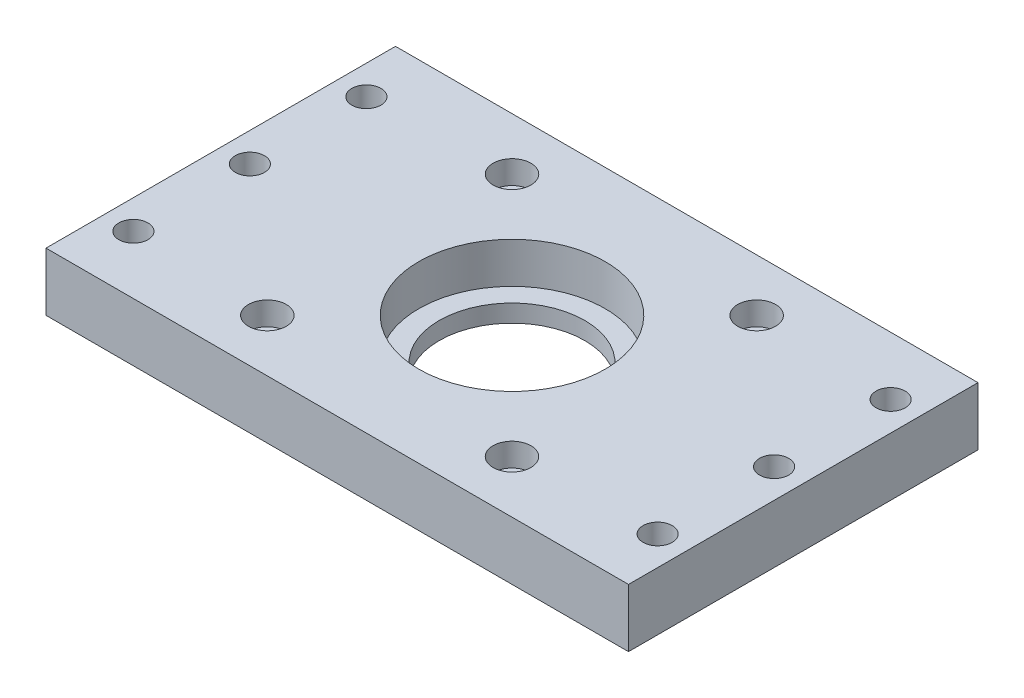
ISO-10303-21;
HEADER;
FILE_DESCRIPTION(('STEP AP214'),'2;1');
FILE_NAME('part.step','',(''),(''),'','','');
FILE_SCHEMA(('AUTOMOTIVE_DESIGN { 1 0 10303 214 1 1 1 1 }'));
ENDSEC;
DATA;
#1=APPLICATION_CONTEXT('core data for automotive mechanical design processes');
#2=APPLICATION_PROTOCOL_DEFINITION('international standard','automotive_design',2000,#1);
#3=PRODUCT_CONTEXT('',#1,'mechanical');
#4=PRODUCT('Part','Part','',(#3));
#5=PRODUCT_RELATED_PRODUCT_CATEGORY('part','',(#4));
#6=PRODUCT_DEFINITION_FORMATION('','',#4);
#7=PRODUCT_DEFINITION_CONTEXT('part definition',#1,'design');
#8=PRODUCT_DEFINITION('design','',#6,#7);
#9=PRODUCT_DEFINITION_SHAPE('','',#8);
#10=(LENGTH_UNIT() NAMED_UNIT(*) SI_UNIT(.MILLI.,.METRE.));
#11=(NAMED_UNIT(*) PLANE_ANGLE_UNIT() SI_UNIT($,.RADIAN.));
#12=(NAMED_UNIT(*) SI_UNIT($,.STERADIAN.) SOLID_ANGLE_UNIT());
#13=UNCERTAINTY_MEASURE_WITH_UNIT(LENGTH_MEASURE(1.E-05),#10,'distance_accuracy_value','');
#14=(GEOMETRIC_REPRESENTATION_CONTEXT(3) GLOBAL_UNCERTAINTY_ASSIGNED_CONTEXT((#13)) GLOBAL_UNIT_ASSIGNED_CONTEXT((#10,
#11,#12)) REPRESENTATION_CONTEXT('',''));
#15=CARTESIAN_POINT('',(0.,0.,0.));
#16=DIRECTION('',(0.,0.,1.));
#17=DIRECTION('',(1.,0.,0.));
#18=AXIS2_PLACEMENT_3D('',#15,#16,#17);
#19=CARTESIAN_POINT('',(20.9999999999998,0.,-21.0000000000002));
#20=DIRECTION('',(0.,1.,0.));
#21=DIRECTION('',(0.,0.,1.));
#22=AXIS2_PLACEMENT_3D('',#19,#20,#21);
#23=CYLINDRICAL_SURFACE('',#22,1.5);
#24=CARTESIAN_POINT('',(20.9999999999998,0.,-21.0000000000002));
#25=DIRECTION('',(0.,1.,0.));
#26=DIRECTION('',(-1.,0.,0.));
#27=AXIS2_PLACEMENT_3D('',#24,#25,#26);
#28=CIRCLE('',#27,1.5);
#29=CARTESIAN_POINT('',(19.4999999999998,0.,-21.0000000000002));
#30=VERTEX_POINT('',#29);
#31=EDGE_CURVE('E130',#30,#30,#28,.T.);
#32=ORIENTED_EDGE('',*,*,#31,.F.);
#33=EDGE_LOOP('',(#32));
#34=FACE_BOUND('',#33,.T.);
#35=CARTESIAN_POINT('',(20.9999999999998,6.,-21.0000000000002));
#36=DIRECTION('',(0.,1.,0.));
#37=DIRECTION('',(0.,0.,1.));
#38=AXIS2_PLACEMENT_3D('',#35,#36,#37);
#39=CIRCLE('',#38,1.5);
#40=CARTESIAN_POINT('',(20.9999999999998,6.,-19.5000000000002));
#41=VERTEX_POINT('',#40);
#42=EDGE_CURVE('E45',#41,#41,#39,.F.);
#43=ORIENTED_EDGE('',*,*,#42,.F.);
#44=EDGE_LOOP('',(#43));
#45=FACE_BOUND('',#44,.T.);
#46=ADVANCED_FACE('F41',(#34,#45),#23,.F.);
#47=CARTESIAN_POINT('',(21.,0.,21.));
#48=DIRECTION('',(0.,1.,0.));
#49=DIRECTION('',(0.,0.,1.));
#50=AXIS2_PLACEMENT_3D('',#47,#48,#49);
#51=CYLINDRICAL_SURFACE('',#50,1.5);
#52=CARTESIAN_POINT('',(21.,0.,21.));
#53=DIRECTION('',(0.,1.,0.));
#54=DIRECTION('',(0.,0.,-1.));
#55=AXIS2_PLACEMENT_3D('',#52,#53,#54);
#56=CIRCLE('',#55,1.5);
#57=CARTESIAN_POINT('',(21.,0.,19.5));
#58=VERTEX_POINT('',#57);
#59=EDGE_CURVE('E134',#58,#58,#56,.T.);
#60=ORIENTED_EDGE('',*,*,#59,.F.);
#61=EDGE_LOOP('',(#60));
#62=FACE_BOUND('',#61,.T.);
#63=CARTESIAN_POINT('',(21.,6.,21.));
#64=DIRECTION('',(0.,1.,0.));
#65=DIRECTION('',(0.,0.,1.));
#66=AXIS2_PLACEMENT_3D('',#63,#64,#65);
#67=CIRCLE('',#66,1.5);
#68=CARTESIAN_POINT('',(21.,6.,22.5));
#69=VERTEX_POINT('',#68);
#70=EDGE_CURVE('E124',#69,#69,#67,.F.);
#71=ORIENTED_EDGE('',*,*,#70,.F.);
#72=EDGE_LOOP('',(#71));
#73=FACE_BOUND('',#72,.T.);
#74=ADVANCED_FACE('F222',(#62,#73),#51,.F.);
#75=CARTESIAN_POINT('',(-20.9999999999999,0.,21.0000000000001));
#76=DIRECTION('',(0.,1.,0.));
#77=DIRECTION('',(0.,0.,1.));
#78=AXIS2_PLACEMENT_3D('',#75,#76,#77);
#79=CYLINDRICAL_SURFACE('',#78,1.5);
#80=CARTESIAN_POINT('',(-20.9999999999999,0.,21.0000000000001));
#81=DIRECTION('',(0.,1.,0.));
#82=DIRECTION('',(1.,0.,0.));
#83=AXIS2_PLACEMENT_3D('',#80,#81,#82);
#84=CIRCLE('',#83,1.5);
#85=CARTESIAN_POINT('',(-19.4999999999999,0.,21.0000000000001));
#86=VERTEX_POINT('',#85);
#87=EDGE_CURVE('E139',#86,#86,#84,.T.);
#88=ORIENTED_EDGE('',*,*,#87,.F.);
#89=EDGE_LOOP('',(#88));
#90=FACE_BOUND('',#89,.T.);
#91=CARTESIAN_POINT('',(-20.9999999999999,6.,21.0000000000001));
#92=DIRECTION('',(0.,1.,0.));
#93=DIRECTION('',(0.,0.,1.));
#94=AXIS2_PLACEMENT_3D('',#91,#92,#93);
#95=CIRCLE('',#94,1.5);
#96=CARTESIAN_POINT('',(-20.9999999999999,6.,22.5000000000001));
#97=VERTEX_POINT('',#96);
#98=EDGE_CURVE('E122',#97,#97,#95,.F.);
#99=ORIENTED_EDGE('',*,*,#98,.F.);
#100=EDGE_LOOP('',(#99));
#101=FACE_BOUND('',#100,.T.);
#102=ADVANCED_FACE('F228',(#90,#101),#79,.F.);
#103=CARTESIAN_POINT('',(-21.,0.,-21.));
#104=DIRECTION('',(0.,1.,0.));
#105=DIRECTION('',(0.,0.,1.));
#106=AXIS2_PLACEMENT_3D('',#103,#104,#105);
#107=CYLINDRICAL_SURFACE('',#106,1.5);
#108=CARTESIAN_POINT('',(-21.,0.,-21.));
#109=DIRECTION('',(0.,1.,0.));
#110=DIRECTION('',(0.,0.,1.));
#111=AXIS2_PLACEMENT_3D('',#108,#109,#110);
#112=CIRCLE('',#111,1.5);
#113=CARTESIAN_POINT('',(-21.,0.,-19.5));
#114=VERTEX_POINT('',#113);
#115=EDGE_CURVE('E120',#114,#114,#112,.T.);
#116=ORIENTED_EDGE('',*,*,#115,.F.);
#117=EDGE_LOOP('',(#116));
#118=FACE_BOUND('',#117,.T.);
#119=CARTESIAN_POINT('',(-21.,6.,-21.));
#120=DIRECTION('',(0.,1.,0.));
#121=DIRECTION('',(0.,0.,1.));
#122=AXIS2_PLACEMENT_3D('',#119,#120,#121);
#123=CIRCLE('',#122,1.5);
#124=CARTESIAN_POINT('',(-21.,6.,-19.5));
#125=VERTEX_POINT('',#124);
#126=EDGE_CURVE('E117',#125,#125,#123,.F.);
#127=ORIENTED_EDGE('',*,*,#126,.F.);
#128=EDGE_LOOP('',(#127));
#129=FACE_BOUND('',#128,.T.);
#130=ADVANCED_FACE('F244',(#118,#129),#107,.F.);
#131=CARTESIAN_POINT('',(50.,10.,-30.));
#132=DIRECTION('',(-1.,0.,0.));
#133=DIRECTION('',(0.,0.,1.));
#134=AXIS2_PLACEMENT_3D('',#131,#132,#133);
#135=PLANE('',#134);
#136=DIRECTION('',(0.,0.,-1.));
#137=VECTOR('',#136,1.);
#138=CARTESIAN_POINT('',(50.,0.,-30.));
#139=LINE('',#138,#137);
#140=CARTESIAN_POINT('',(50.,0.,30.));
#141=VERTEX_POINT('',#140);
#142=CARTESIAN_POINT('',(50.,0.,-30.));
#143=VERTEX_POINT('',#142);
#144=EDGE_CURVE('E108',#141,#143,#139,.T.);
#145=ORIENTED_EDGE('',*,*,#144,.T.);
#146=DIRECTION('',(0.,-1.,0.));
#147=VECTOR('',#146,1.);
#148=CARTESIAN_POINT('',(50.,10.,-30.));
#149=LINE('',#148,#147);
#150=CARTESIAN_POINT('',(50.,10.,-30.));
#151=VERTEX_POINT('',#150);
#152=EDGE_CURVE('E11',#151,#143,#149,.T.);
#153=ORIENTED_EDGE('',*,*,#152,.F.);
#154=DIRECTION('',(0.,0.,-1.));
#155=VECTOR('',#154,1.);
#156=CARTESIAN_POINT('',(50.,10.,-30.));
#157=LINE('',#156,#155);
#158=CARTESIAN_POINT('',(50.,10.,30.));
#159=VERTEX_POINT('',#158);
#160=EDGE_CURVE('E95',#159,#151,#157,.T.);
#161=ORIENTED_EDGE('',*,*,#160,.F.);
#162=DIRECTION('',(0.,-1.,0.));
#163=VECTOR('',#162,1.);
#164=CARTESIAN_POINT('',(50.,10.,30.));
#165=LINE('',#164,#163);
#166=EDGE_CURVE('E104',#159,#141,#165,.T.);
#167=ORIENTED_EDGE('',*,*,#166,.T.);
#168=EDGE_LOOP('',(#145,#153,#161,#167));
#169=FACE_BOUND('',#168,.T.);
#170=ADVANCED_FACE('F43',(#169),#135,.F.);
#171=CARTESIAN_POINT('',(-50.,10.,-30.));
#172=DIRECTION('',(0.,0.,1.));
#173=DIRECTION('',(1.,0.,0.));
#174=AXIS2_PLACEMENT_3D('',#171,#172,#173);
#175=PLANE('',#174);
#176=DIRECTION('',(-1.,0.,0.));
#177=VECTOR('',#176,1.);
#178=CARTESIAN_POINT('',(-50.,0.,-30.));
#179=LINE('',#178,#177);
#180=CARTESIAN_POINT('',(-50.,0.,-30.));
#181=VERTEX_POINT('',#180);
#182=EDGE_CURVE('E99',#143,#181,#179,.T.);
#183=ORIENTED_EDGE('',*,*,#182,.T.);
#184=DIRECTION('',(0.,-1.,0.));
#185=VECTOR('',#184,1.);
#186=CARTESIAN_POINT('',(-50.,10.,-30.));
#187=LINE('',#186,#185);
#188=CARTESIAN_POINT('',(-50.,10.,-30.));
#189=VERTEX_POINT('',#188);
#190=EDGE_CURVE('E51',#189,#181,#187,.T.);
#191=ORIENTED_EDGE('',*,*,#190,.F.);
#192=DIRECTION('',(-1.,0.,0.));
#193=VECTOR('',#192,1.);
#194=CARTESIAN_POINT('',(-50.,10.,-30.));
#195=LINE('',#194,#193);
#196=EDGE_CURVE('E90',#151,#189,#195,.T.);
#197=ORIENTED_EDGE('',*,*,#196,.F.);
#198=ORIENTED_EDGE('',*,*,#152,.T.);
#199=EDGE_LOOP('',(#183,#191,#197,#198));
#200=FACE_BOUND('',#199,.T.);
#201=ADVANCED_FACE('F98',(#200),#175,.F.);
#202=CARTESIAN_POINT('',(-50.,10.,-30.));
#203=DIRECTION('',(1.,0.,0.));
#204=DIRECTION('',(0.,0.,-1.));
#205=AXIS2_PLACEMENT_3D('',#202,#203,#204);
#206=PLANE('',#205);
#207=DIRECTION('',(0.,0.,1.));
#208=VECTOR('',#207,1.);
#209=CARTESIAN_POINT('',(-50.,0.,-30.));
#210=LINE('',#209,#208);
#211=CARTESIAN_POINT('',(-50.,0.,30.));
#212=VERTEX_POINT('',#211);
#213=EDGE_CURVE('E77',#181,#212,#210,.T.);
#214=ORIENTED_EDGE('',*,*,#213,.T.);
#215=DIRECTION('',(0.,-1.,0.));
#216=VECTOR('',#215,1.);
#217=CARTESIAN_POINT('',(-50.,10.,30.));
#218=LINE('',#217,#216);
#219=CARTESIAN_POINT('',(-50.,10.,30.));
#220=VERTEX_POINT('',#219);
#221=EDGE_CURVE('E100',#220,#212,#218,.T.);
#222=ORIENTED_EDGE('',*,*,#221,.F.);
#223=DIRECTION('',(0.,0.,1.));
#224=VECTOR('',#223,1.);
#225=CARTESIAN_POINT('',(-50.,10.,-30.));
#226=LINE('',#225,#224);
#227=EDGE_CURVE('E93',#189,#220,#226,.T.);
#228=ORIENTED_EDGE('',*,*,#227,.F.);
#229=ORIENTED_EDGE('',*,*,#190,.T.);
#230=EDGE_LOOP('',(#214,#222,#228,#229));
#231=FACE_BOUND('',#230,.T.);
#232=ADVANCED_FACE('F102',(#231),#206,.F.);
#233=CARTESIAN_POINT('',(-50.,10.,30.));
#234=DIRECTION('',(0.,0.,-1.));
#235=DIRECTION('',(-1.,0.,0.));
#236=AXIS2_PLACEMENT_3D('',#233,#234,#235);
#237=PLANE('',#236);
#238=DIRECTION('',(1.,0.,0.));
#239=VECTOR('',#238,1.);
#240=CARTESIAN_POINT('',(-50.,0.,30.));
#241=LINE('',#240,#239);
#242=EDGE_CURVE('E83',#212,#141,#241,.T.);
#243=ORIENTED_EDGE('',*,*,#242,.T.);
#244=ORIENTED_EDGE('',*,*,#166,.F.);
#245=DIRECTION('',(1.,0.,0.));
#246=VECTOR('',#245,1.);
#247=CARTESIAN_POINT('',(-50.,10.,30.));
#248=LINE('',#247,#246);
#249=EDGE_CURVE('E60',#220,#159,#248,.T.);
#250=ORIENTED_EDGE('',*,*,#249,.F.);
#251=ORIENTED_EDGE('',*,*,#221,.T.);
#252=EDGE_LOOP('',(#243,#244,#250,#251));
#253=FACE_BOUND('',#252,.T.);
#254=ADVANCED_FACE('F209',(#253),#237,.F.);
#255=CARTESIAN_POINT('',(0.,10.,0.));
#256=DIRECTION('',(0.,1.,0.));
#257=DIRECTION('',(0.,0.,1.));
#258=AXIS2_PLACEMENT_3D('',#255,#256,#257);
#259=PLANE('',#258);
#260=CARTESIAN_POINT('',(-20.9999999999999,10.,21.0000000000001));
#261=DIRECTION('',(0.,1.,0.));
#262=DIRECTION('',(1.,0.,0.));
#263=AXIS2_PLACEMENT_3D('',#260,#261,#262);
#264=CIRCLE('',#263,3.25);
#265=CARTESIAN_POINT('',(-17.7499999999999,10.,21.0000000000001));
#266=VERTEX_POINT('',#265);
#267=EDGE_CURVE('E545',#266,#266,#264,.T.);
#268=ORIENTED_EDGE('',*,*,#267,.F.);
#269=EDGE_LOOP('',(#268));
#270=FACE_BOUND('',#269,.T.);
#271=CARTESIAN_POINT('',(21.,10.,21.));
#272=DIRECTION('',(0.,1.,0.));
#273=DIRECTION('',(0.,0.,-1.));
#274=AXIS2_PLACEMENT_3D('',#271,#272,#273);
#275=CIRCLE('',#274,3.25);
#276=CARTESIAN_POINT('',(21.,10.,17.75));
#277=VERTEX_POINT('',#276);
#278=EDGE_CURVE('E539',#277,#277,#275,.T.);
#279=ORIENTED_EDGE('',*,*,#278,.F.);
#280=EDGE_LOOP('',(#279));
#281=FACE_BOUND('',#280,.T.);
#282=CARTESIAN_POINT('',(20.9999999999998,10.,-21.0000000000002));
#283=DIRECTION('',(0.,1.,0.));
#284=DIRECTION('',(-1.,0.,0.));
#285=AXIS2_PLACEMENT_3D('',#282,#283,#284);
#286=CIRCLE('',#285,3.25);
#287=CARTESIAN_POINT('',(17.7499999999998,10.,-21.0000000000002));
#288=VERTEX_POINT('',#287);
#289=EDGE_CURVE('E533',#288,#288,#286,.T.);
#290=ORIENTED_EDGE('',*,*,#289,.F.);
#291=EDGE_LOOP('',(#290));
#292=FACE_BOUND('',#291,.T.);
#293=CARTESIAN_POINT('',(-21.,10.,-21.));
#294=DIRECTION('',(0.,1.,0.));
#295=DIRECTION('',(0.,0.,1.));
#296=AXIS2_PLACEMENT_3D('',#293,#294,#295);
#297=CIRCLE('',#296,3.25);
#298=CARTESIAN_POINT('',(-21.,10.,-17.75));
#299=VERTEX_POINT('',#298);
#300=EDGE_CURVE('E145',#299,#299,#297,.T.);
#301=ORIENTED_EDGE('',*,*,#300,.F.);
#302=EDGE_LOOP('',(#301));
#303=FACE_BOUND('',#302,.T.);
#304=CARTESIAN_POINT('',(0.,10.,0.));
#305=DIRECTION('',(0.,1.,0.));
#306=DIRECTION('',(0.,0.,1.));
#307=AXIS2_PLACEMENT_3D('',#304,#305,#306);
#308=CIRCLE('',#307,16.);
#309=CARTESIAN_POINT('',(0.,10.,16.));
#310=VERTEX_POINT('',#309);
#311=EDGE_CURVE('E154',#310,#310,#308,.T.);
#312=ORIENTED_EDGE('',*,*,#311,.F.);
#313=EDGE_LOOP('',(#312));
#314=FACE_BOUND('',#313,.T.);
#315=CARTESIAN_POINT('',(45.,10.,20.));
#316=DIRECTION('',(0.,-1.,0.));
#317=DIRECTION('',(0.,0.,1.));
#318=AXIS2_PLACEMENT_3D('',#315,#316,#317);
#319=CIRCLE('',#318,2.5);
#320=CARTESIAN_POINT('',(45.,10.,22.5));
#321=VERTEX_POINT('',#320);
#322=EDGE_CURVE('E167',#321,#321,#319,.T.);
#323=ORIENTED_EDGE('',*,*,#322,.T.);
#324=EDGE_LOOP('',(#323));
#325=FACE_BOUND('',#324,.T.);
#326=CARTESIAN_POINT('',(45.,10.,0.));
#327=DIRECTION('',(0.,-1.,0.));
#328=DIRECTION('',(0.,0.,1.));
#329=AXIS2_PLACEMENT_3D('',#326,#327,#328);
#330=CIRCLE('',#329,2.5);
#331=CARTESIAN_POINT('',(45.,10.,2.5));
#332=VERTEX_POINT('',#331);
#333=EDGE_CURVE('E173',#332,#332,#330,.T.);
#334=ORIENTED_EDGE('',*,*,#333,.T.);
#335=EDGE_LOOP('',(#334));
#336=FACE_BOUND('',#335,.T.);
#337=CARTESIAN_POINT('',(45.,10.,-20.));
#338=DIRECTION('',(0.,-1.,0.));
#339=DIRECTION('',(0.,0.,1.));
#340=AXIS2_PLACEMENT_3D('',#337,#338,#339);
#341=CIRCLE('',#340,2.5);
#342=CARTESIAN_POINT('',(45.,10.,-17.5));
#343=VERTEX_POINT('',#342);
#344=EDGE_CURVE('E160',#343,#343,#341,.T.);
#345=ORIENTED_EDGE('',*,*,#344,.T.);
#346=EDGE_LOOP('',(#345));
#347=FACE_BOUND('',#346,.T.);
#348=CARTESIAN_POINT('',(-45.,10.,20.));
#349=DIRECTION('',(0.,1.,0.));
#350=DIRECTION('',(0.,0.,1.));
#351=AXIS2_PLACEMENT_3D('',#348,#349,#350);
#352=CIRCLE('',#351,2.5);
#353=CARTESIAN_POINT('',(-45.,10.,22.5));
#354=VERTEX_POINT('',#353);
#355=EDGE_CURVE('E183',#354,#354,#352,.T.);
#356=ORIENTED_EDGE('',*,*,#355,.F.);
#357=EDGE_LOOP('',(#356));
#358=FACE_BOUND('',#357,.T.);
#359=CARTESIAN_POINT('',(-45.,10.,0.));
#360=DIRECTION('',(0.,1.,0.));
#361=DIRECTION('',(0.,0.,1.));
#362=AXIS2_PLACEMENT_3D('',#359,#360,#361);
#363=CIRCLE('',#362,2.5);
#364=CARTESIAN_POINT('',(-45.,10.,2.5));
#365=VERTEX_POINT('',#364);
#366=EDGE_CURVE('E186',#365,#365,#363,.T.);
#367=ORIENTED_EDGE('',*,*,#366,.F.);
#368=EDGE_LOOP('',(#367));
#369=FACE_BOUND('',#368,.T.);
#370=CARTESIAN_POINT('',(-45.,10.,-20.));
#371=DIRECTION('',(0.,1.,0.));
#372=DIRECTION('',(0.,0.,1.));
#373=AXIS2_PLACEMENT_3D('',#370,#371,#372);
#374=CIRCLE('',#373,2.5);
#375=CARTESIAN_POINT('',(-45.,10.,-17.5));
#376=VERTEX_POINT('',#375);
#377=EDGE_CURVE('E192',#376,#376,#374,.T.);
#378=ORIENTED_EDGE('',*,*,#377,.F.);
#379=EDGE_LOOP('',(#378));
#380=FACE_BOUND('',#379,.T.);
#381=ORIENTED_EDGE('',*,*,#160,.T.);
#382=ORIENTED_EDGE('',*,*,#196,.T.);
#383=ORIENTED_EDGE('',*,*,#227,.T.);
#384=ORIENTED_EDGE('',*,*,#249,.T.);
#385=EDGE_LOOP('',(#381,#382,#383,#384));
#386=FACE_BOUND('',#385,.T.);
#387=ADVANCED_FACE('F91',(#270,#281,#292,#303,#314,#325,#336,#347,#358,#369,#380,#386),#259,.T.);
#388=CARTESIAN_POINT('',(0.,0.,0.));
#389=DIRECTION('',(0.,1.,0.));
#390=DIRECTION('',(0.,0.,1.));
#391=AXIS2_PLACEMENT_3D('',#388,#389,#390);
#392=PLANE('',#391);
#393=ORIENTED_EDGE('',*,*,#87,.T.);
#394=EDGE_LOOP('',(#393));
#395=FACE_BOUND('',#394,.T.);
#396=ORIENTED_EDGE('',*,*,#59,.T.);
#397=EDGE_LOOP('',(#396));
#398=FACE_BOUND('',#397,.T.);
#399=ORIENTED_EDGE('',*,*,#31,.T.);
#400=EDGE_LOOP('',(#399));
#401=FACE_BOUND('',#400,.T.);
#402=ORIENTED_EDGE('',*,*,#115,.T.);
#403=EDGE_LOOP('',(#402));
#404=FACE_BOUND('',#403,.T.);
#405=CARTESIAN_POINT('',(0.,0.,0.));
#406=DIRECTION('',(0.,1.,0.));
#407=DIRECTION('',(0.,0.,1.));
#408=AXIS2_PLACEMENT_3D('',#405,#406,#407);
#409=CIRCLE('',#408,12.5);
#410=CARTESIAN_POINT('',(0.,0.,12.5));
#411=VERTEX_POINT('',#410);
#412=EDGE_CURVE('E151',#411,#411,#409,.T.);
#413=ORIENTED_EDGE('',*,*,#412,.T.);
#414=EDGE_LOOP('',(#413));
#415=FACE_BOUND('',#414,.T.);
#416=CARTESIAN_POINT('',(45.,0.,20.));
#417=DIRECTION('',(0.,-1.,0.));
#418=DIRECTION('',(0.,0.,1.));
#419=AXIS2_PLACEMENT_3D('',#416,#417,#418);
#420=CIRCLE('',#419,2.5);
#421=CARTESIAN_POINT('',(45.,0.,22.5));
#422=VERTEX_POINT('',#421);
#423=EDGE_CURVE('E163',#422,#422,#420,.T.);
#424=ORIENTED_EDGE('',*,*,#423,.F.);
#425=EDGE_LOOP('',(#424));
#426=FACE_BOUND('',#425,.T.);
#427=CARTESIAN_POINT('',(45.,0.,0.));
#428=DIRECTION('',(0.,-1.,0.));
#429=DIRECTION('',(0.,0.,1.));
#430=AXIS2_PLACEMENT_3D('',#427,#428,#429);
#431=CIRCLE('',#430,2.5);
#432=CARTESIAN_POINT('',(45.,0.,2.5));
#433=VERTEX_POINT('',#432);
#434=EDGE_CURVE('E170',#433,#433,#431,.T.);
#435=ORIENTED_EDGE('',*,*,#434,.F.);
#436=EDGE_LOOP('',(#435));
#437=FACE_BOUND('',#436,.T.);
#438=CARTESIAN_POINT('',(45.,0.,-20.));
#439=DIRECTION('',(0.,-1.,0.));
#440=DIRECTION('',(0.,0.,1.));
#441=AXIS2_PLACEMENT_3D('',#438,#439,#440);
#442=CIRCLE('',#441,2.5);
#443=CARTESIAN_POINT('',(45.,0.,-17.5));
#444=VERTEX_POINT('',#443);
#445=EDGE_CURVE('E176',#444,#444,#442,.T.);
#446=ORIENTED_EDGE('',*,*,#445,.F.);
#447=EDGE_LOOP('',(#446));
#448=FACE_BOUND('',#447,.T.);
#449=CARTESIAN_POINT('',(-45.,0.,20.));
#450=DIRECTION('',(0.,1.,0.));
#451=DIRECTION('',(0.,0.,1.));
#452=AXIS2_PLACEMENT_3D('',#449,#450,#451);
#453=CIRCLE('',#452,2.5);
#454=CARTESIAN_POINT('',(-45.,0.,22.5));
#455=VERTEX_POINT('',#454);
#456=EDGE_CURVE('E111',#455,#455,#453,.T.);
#457=ORIENTED_EDGE('',*,*,#456,.T.);
#458=EDGE_LOOP('',(#457));
#459=FACE_BOUND('',#458,.T.);
#460=CARTESIAN_POINT('',(-45.,0.,0.));
#461=DIRECTION('',(0.,1.,0.));
#462=DIRECTION('',(0.,0.,1.));
#463=AXIS2_PLACEMENT_3D('',#460,#461,#462);
#464=CIRCLE('',#463,2.5);
#465=CARTESIAN_POINT('',(-45.,0.,2.5));
#466=VERTEX_POINT('',#465);
#467=EDGE_CURVE('E189',#466,#466,#464,.T.);
#468=ORIENTED_EDGE('',*,*,#467,.T.);
#469=EDGE_LOOP('',(#468));
#470=FACE_BOUND('',#469,.T.);
#471=CARTESIAN_POINT('',(-45.,0.,-20.));
#472=DIRECTION('',(0.,1.,0.));
#473=DIRECTION('',(0.,0.,1.));
#474=AXIS2_PLACEMENT_3D('',#471,#472,#473);
#475=CIRCLE('',#474,2.5);
#476=CARTESIAN_POINT('',(-45.,0.,-17.5));
#477=VERTEX_POINT('',#476);
#478=EDGE_CURVE('E166',#477,#477,#475,.T.);
#479=ORIENTED_EDGE('',*,*,#478,.T.);
#480=EDGE_LOOP('',(#479));
#481=FACE_BOUND('',#480,.T.);
#482=ORIENTED_EDGE('',*,*,#144,.F.);
#483=ORIENTED_EDGE('',*,*,#242,.F.);
#484=ORIENTED_EDGE('',*,*,#213,.F.);
#485=ORIENTED_EDGE('',*,*,#182,.F.);
#486=EDGE_LOOP('',(#482,#483,#484,#485));
#487=FACE_BOUND('',#486,.T.);
#488=ADVANCED_FACE('F198',(#395,#398,#401,#404,#415,#426,#437,#448,#459,#470,#481,#487),#392,.F.);
#489=CARTESIAN_POINT('',(-45.,0.,-20.));
#490=DIRECTION('',(0.,1.,0.));
#491=DIRECTION('',(0.,0.,1.));
#492=AXIS2_PLACEMENT_3D('',#489,#490,#491);
#493=CYLINDRICAL_SURFACE('',#492,2.5);
#494=ORIENTED_EDGE('',*,*,#478,.F.);
#495=EDGE_LOOP('',(#494));
#496=FACE_BOUND('',#495,.T.);
#497=ORIENTED_EDGE('',*,*,#377,.T.);
#498=EDGE_LOOP('',(#497));
#499=FACE_BOUND('',#498,.T.);
#500=ADVANCED_FACE('F201',(#496,#499),#493,.F.);
#501=CARTESIAN_POINT('',(-45.,0.,0.));
#502=DIRECTION('',(0.,1.,0.));
#503=DIRECTION('',(0.,0.,1.));
#504=AXIS2_PLACEMENT_3D('',#501,#502,#503);
#505=CYLINDRICAL_SURFACE('',#504,2.5);
#506=ORIENTED_EDGE('',*,*,#467,.F.);
#507=EDGE_LOOP('',(#506));
#508=FACE_BOUND('',#507,.T.);
#509=ORIENTED_EDGE('',*,*,#366,.T.);
#510=EDGE_LOOP('',(#509));
#511=FACE_BOUND('',#510,.T.);
#512=ADVANCED_FACE('F204',(#508,#511),#505,.F.);
#513=CARTESIAN_POINT('',(-45.,0.,20.));
#514=DIRECTION('',(0.,1.,0.));
#515=DIRECTION('',(0.,0.,1.));
#516=AXIS2_PLACEMENT_3D('',#513,#514,#515);
#517=CYLINDRICAL_SURFACE('',#516,2.5);
#518=ORIENTED_EDGE('',*,*,#456,.F.);
#519=EDGE_LOOP('',(#518));
#520=FACE_BOUND('',#519,.T.);
#521=ORIENTED_EDGE('',*,*,#355,.T.);
#522=EDGE_LOOP('',(#521));
#523=FACE_BOUND('',#522,.T.);
#524=ADVANCED_FACE('F270',(#520,#523),#517,.F.);
#525=CARTESIAN_POINT('',(45.,0.,-20.));
#526=DIRECTION('',(0.,1.,0.));
#527=DIRECTION('',(0.,0.,1.));
#528=AXIS2_PLACEMENT_3D('',#525,#526,#527);
#529=CYLINDRICAL_SURFACE('',#528,2.5);
#530=ORIENTED_EDGE('',*,*,#445,.T.);
#531=EDGE_LOOP('',(#530));
#532=FACE_BOUND('',#531,.T.);
#533=ORIENTED_EDGE('',*,*,#344,.F.);
#534=EDGE_LOOP('',(#533));
#535=FACE_BOUND('',#534,.T.);
#536=ADVANCED_FACE('F266',(#532,#535),#529,.F.);
#537=CARTESIAN_POINT('',(45.,0.,0.));
#538=DIRECTION('',(0.,1.,0.));
#539=DIRECTION('',(0.,0.,1.));
#540=AXIS2_PLACEMENT_3D('',#537,#538,#539);
#541=CYLINDRICAL_SURFACE('',#540,2.5);
#542=ORIENTED_EDGE('',*,*,#434,.T.);
#543=EDGE_LOOP('',(#542));
#544=FACE_BOUND('',#543,.T.);
#545=ORIENTED_EDGE('',*,*,#333,.F.);
#546=EDGE_LOOP('',(#545));
#547=FACE_BOUND('',#546,.T.);
#548=ADVANCED_FACE('F262',(#544,#547),#541,.F.);
#549=CARTESIAN_POINT('',(45.,0.,20.));
#550=DIRECTION('',(0.,1.,0.));
#551=DIRECTION('',(0.,0.,1.));
#552=AXIS2_PLACEMENT_3D('',#549,#550,#551);
#553=CYLINDRICAL_SURFACE('',#552,2.5);
#554=ORIENTED_EDGE('',*,*,#423,.T.);
#555=EDGE_LOOP('',(#554));
#556=FACE_BOUND('',#555,.T.);
#557=ORIENTED_EDGE('',*,*,#322,.F.);
#558=EDGE_LOOP('',(#557));
#559=FACE_BOUND('',#558,.T.);
#560=ADVANCED_FACE('F258',(#556,#559),#553,.F.);
#561=CARTESIAN_POINT('',(0.,3.,0.));
#562=DIRECTION('',(0.,1.,0.));
#563=DIRECTION('',(0.,0.,1.));
#564=AXIS2_PLACEMENT_3D('',#561,#562,#563);
#565=CYLINDRICAL_SURFACE('',#564,16.);
#566=CARTESIAN_POINT('',(0.,3.,0.));
#567=DIRECTION('',(0.,1.,0.));
#568=DIRECTION('',(0.,0.,1.));
#569=AXIS2_PLACEMENT_3D('',#566,#567,#568);
#570=CIRCLE('',#569,16.);
#571=CARTESIAN_POINT('',(0.,3.,16.));
#572=VERTEX_POINT('',#571);
#573=EDGE_CURVE('E157',#572,#572,#570,.T.);
#574=ORIENTED_EDGE('',*,*,#573,.F.);
#575=EDGE_LOOP('',(#574));
#576=FACE_BOUND('',#575,.T.);
#577=ORIENTED_EDGE('',*,*,#311,.T.);
#578=EDGE_LOOP('',(#577));
#579=FACE_BOUND('',#578,.T.);
#580=ADVANCED_FACE('F254',(#576,#579),#565,.F.);
#581=CARTESIAN_POINT('',(0.,3.,0.));
#582=DIRECTION('',(0.,1.,0.));
#583=DIRECTION('',(0.,0.,1.));
#584=AXIS2_PLACEMENT_3D('',#581,#582,#583);
#585=PLANE('',#584);
#586=CARTESIAN_POINT('',(0.,3.,0.));
#587=DIRECTION('',(0.,1.,0.));
#588=DIRECTION('',(0.,0.,1.));
#589=AXIS2_PLACEMENT_3D('',#586,#587,#588);
#590=CIRCLE('',#589,12.5);
#591=CARTESIAN_POINT('',(0.,3.,12.5));
#592=VERTEX_POINT('',#591);
#593=EDGE_CURVE('E150',#592,#592,#590,.T.);
#594=ORIENTED_EDGE('',*,*,#593,.F.);
#595=EDGE_LOOP('',(#594));
#596=FACE_BOUND('',#595,.T.);
#597=ORIENTED_EDGE('',*,*,#573,.T.);
#598=EDGE_LOOP('',(#597));
#599=FACE_BOUND('',#598,.T.);
#600=ADVANCED_FACE('F250',(#596,#599),#585,.T.);
#601=CARTESIAN_POINT('',(0.,0.,0.));
#602=DIRECTION('',(0.,1.,0.));
#603=DIRECTION('',(0.,0.,1.));
#604=AXIS2_PLACEMENT_3D('',#601,#602,#603);
#605=CYLINDRICAL_SURFACE('',#604,12.5);
#606=ORIENTED_EDGE('',*,*,#412,.F.);
#607=EDGE_LOOP('',(#606));
#608=FACE_BOUND('',#607,.T.);
#609=ORIENTED_EDGE('',*,*,#593,.T.);
#610=EDGE_LOOP('',(#609));
#611=FACE_BOUND('',#610,.T.);
#612=ADVANCED_FACE('F238',(#608,#611),#605,.F.);
#613=CARTESIAN_POINT('',(-21.,6.,-21.));
#614=DIRECTION('',(0.,1.,0.));
#615=DIRECTION('',(0.,0.,1.));
#616=AXIS2_PLACEMENT_3D('',#613,#614,#615);
#617=PLANE('',#616);
#618=CARTESIAN_POINT('',(-21.,6.,-21.));
#619=DIRECTION('',(0.,1.,0.));
#620=DIRECTION('',(0.,0.,1.));
#621=AXIS2_PLACEMENT_3D('',#618,#619,#620);
#622=CIRCLE('',#621,3.25);
#623=CARTESIAN_POINT('',(-21.,6.,-17.75));
#624=VERTEX_POINT('',#623);
#625=EDGE_CURVE('E121',#624,#624,#622,.T.);
#626=ORIENTED_EDGE('',*,*,#625,.T.);
#627=EDGE_LOOP('',(#626));
#628=FACE_BOUND('',#627,.T.);
#629=ORIENTED_EDGE('',*,*,#126,.T.);
#630=EDGE_LOOP('',(#629));
#631=FACE_BOUND('',#630,.T.);
#632=ADVANCED_FACE('F234',(#628,#631),#617,.T.);
#633=CARTESIAN_POINT('',(-21.,6.,-21.));
#634=DIRECTION('',(0.,1.,0.));
#635=DIRECTION('',(0.,0.,1.));
#636=AXIS2_PLACEMENT_3D('',#633,#634,#635);
#637=CYLINDRICAL_SURFACE('',#636,3.25);
#638=ORIENTED_EDGE('',*,*,#625,.F.);
#639=EDGE_LOOP('',(#638));
#640=FACE_BOUND('',#639,.T.);
#641=ORIENTED_EDGE('',*,*,#300,.T.);
#642=EDGE_LOOP('',(#641));
#643=FACE_BOUND('',#642,.T.);
#644=ADVANCED_FACE('F237',(#640,#643),#637,.F.);
#645=CARTESIAN_POINT('',(-20.9999999999999,6.,21.0000000000001));
#646=DIRECTION('',(0.,1.,0.));
#647=DIRECTION('',(1.,0.,0.));
#648=AXIS2_PLACEMENT_3D('',#645,#646,#647);
#649=PLANE('',#648);
#650=CARTESIAN_POINT('',(-20.9999999999999,6.,21.0000000000001));
#651=DIRECTION('',(0.,1.,0.));
#652=DIRECTION('',(1.,0.,0.));
#653=AXIS2_PLACEMENT_3D('',#650,#651,#652);
#654=CIRCLE('',#653,3.25);
#655=CARTESIAN_POINT('',(-17.7499999999999,6.,21.0000000000001));
#656=VERTEX_POINT('',#655);
#657=EDGE_CURVE('E125',#656,#656,#654,.T.);
#658=ORIENTED_EDGE('',*,*,#657,.T.);
#659=EDGE_LOOP('',(#658));
#660=FACE_BOUND('',#659,.T.);
#661=ORIENTED_EDGE('',*,*,#98,.T.);
#662=EDGE_LOOP('',(#661));
#663=FACE_BOUND('',#662,.T.);
#664=ADVANCED_FACE('F242',(#660,#663),#649,.T.);
#665=CARTESIAN_POINT('',(-20.9999999999999,6.,21.0000000000001));
#666=DIRECTION('',(0.,1.,0.));
#667=DIRECTION('',(0.,0.,1.));
#668=AXIS2_PLACEMENT_3D('',#665,#666,#667);
#669=CYLINDRICAL_SURFACE('',#668,3.25);
#670=ORIENTED_EDGE('',*,*,#657,.F.);
#671=EDGE_LOOP('',(#670));
#672=FACE_BOUND('',#671,.T.);
#673=ORIENTED_EDGE('',*,*,#267,.T.);
#674=EDGE_LOOP('',(#673));
#675=FACE_BOUND('',#674,.T.);
#676=ADVANCED_FACE('F329',(#672,#675),#669,.F.);
#677=CARTESIAN_POINT('',(21.,6.,21.));
#678=DIRECTION('',(0.,1.,0.));
#679=DIRECTION('',(0.,0.,-1.));
#680=AXIS2_PLACEMENT_3D('',#677,#678,#679);
#681=PLANE('',#680);
#682=CARTESIAN_POINT('',(21.,6.,21.));
#683=DIRECTION('',(0.,1.,0.));
#684=DIRECTION('',(0.,0.,-1.));
#685=AXIS2_PLACEMENT_3D('',#682,#683,#684);
#686=CIRCLE('',#685,3.25);
#687=CARTESIAN_POINT('',(21.,6.,17.75));
#688=VERTEX_POINT('',#687);
#689=EDGE_CURVE('E542',#688,#688,#686,.T.);
#690=ORIENTED_EDGE('',*,*,#689,.T.);
#691=EDGE_LOOP('',(#690));
#692=FACE_BOUND('',#691,.T.);
#693=ORIENTED_EDGE('',*,*,#70,.T.);
#694=EDGE_LOOP('',(#693));
#695=FACE_BOUND('',#694,.T.);
#696=ADVANCED_FACE('F338',(#692,#695),#681,.T.);
#697=CARTESIAN_POINT('',(21.,6.,21.));
#698=DIRECTION('',(0.,1.,0.));
#699=DIRECTION('',(0.,0.,1.));
#700=AXIS2_PLACEMENT_3D('',#697,#698,#699);
#701=CYLINDRICAL_SURFACE('',#700,3.25);
#702=ORIENTED_EDGE('',*,*,#689,.F.);
#703=EDGE_LOOP('',(#702));
#704=FACE_BOUND('',#703,.T.);
#705=ORIENTED_EDGE('',*,*,#278,.T.);
#706=EDGE_LOOP('',(#705));
#707=FACE_BOUND('',#706,.T.);
#708=ADVANCED_FACE('F346',(#704,#707),#701,.F.);
#709=CARTESIAN_POINT('',(20.9999999999998,6.,-21.0000000000002));
#710=DIRECTION('',(0.,1.,0.));
#711=DIRECTION('',(-1.,0.,0.));
#712=AXIS2_PLACEMENT_3D('',#709,#710,#711);
#713=PLANE('',#712);
#714=CARTESIAN_POINT('',(20.9999999999998,6.,-21.0000000000002));
#715=DIRECTION('',(0.,1.,0.));
#716=DIRECTION('',(-1.,0.,0.));
#717=AXIS2_PLACEMENT_3D('',#714,#715,#716);
#718=CIRCLE('',#717,3.25);
#719=CARTESIAN_POINT('',(17.7499999999998,6.,-21.0000000000002));
#720=VERTEX_POINT('',#719);
#721=EDGE_CURVE('E536',#720,#720,#718,.T.);
#722=ORIENTED_EDGE('',*,*,#721,.T.);
#723=EDGE_LOOP('',(#722));
#724=FACE_BOUND('',#723,.T.);
#725=ORIENTED_EDGE('',*,*,#42,.T.);
#726=EDGE_LOOP('',(#725));
#727=FACE_BOUND('',#726,.T.);
#728=ADVANCED_FACE('F354',(#724,#727),#713,.T.);
#729=CARTESIAN_POINT('',(20.9999999999998,6.,-21.0000000000002));
#730=DIRECTION('',(0.,1.,0.));
#731=DIRECTION('',(0.,0.,1.));
#732=AXIS2_PLACEMENT_3D('',#729,#730,#731);
#733=CYLINDRICAL_SURFACE('',#732,3.25);
#734=ORIENTED_EDGE('',*,*,#721,.F.);
#735=EDGE_LOOP('',(#734));
#736=FACE_BOUND('',#735,.T.);
#737=ORIENTED_EDGE('',*,*,#289,.T.);
#738=EDGE_LOOP('',(#737));
#739=FACE_BOUND('',#738,.T.);
#740=ADVANCED_FACE('F362',(#736,#739),#733,.F.);
#741=CLOSED_SHELL('',(#46,#74,#102,#130,#170,#201,#232,#254,#387,#488,#500,#512,#524,#536,#548,
#560,#580,#600,#612,#632,#644,#664,#676,#696,#708,#728,#740));
#742=MANIFOLD_SOLID_BREP('B2',#741);
#743=ADVANCED_BREP_SHAPE_REPRESENTATION('',(#18,#742),#14);
#744=SHAPE_DEFINITION_REPRESENTATION(#9,#743);
ENDSEC;
END-ISO-10303-21;
